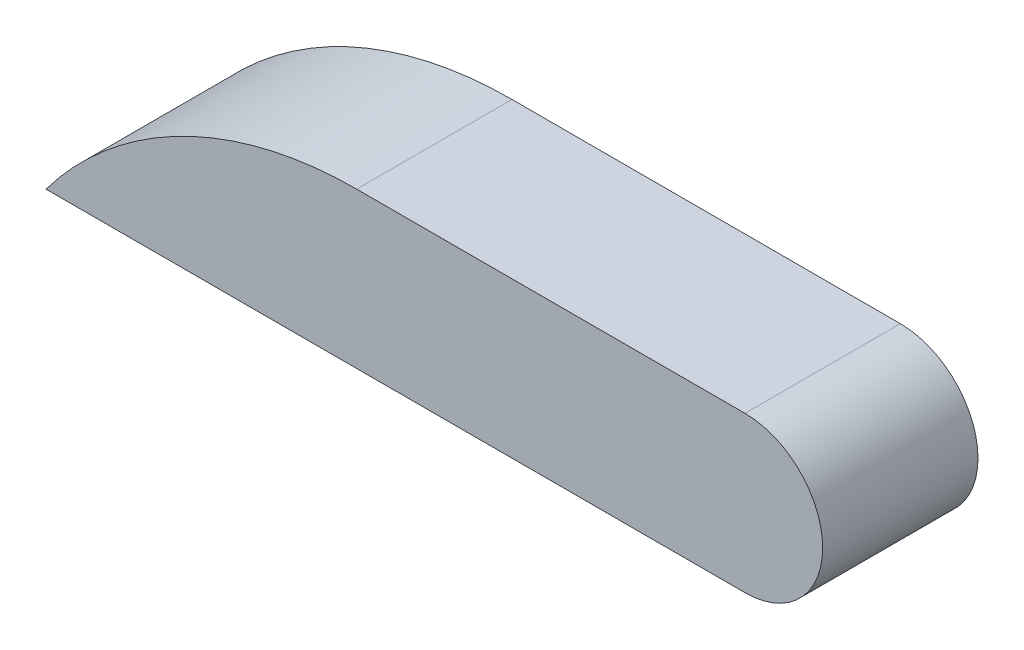
ISO-10303-21;
HEADER;
FILE_DESCRIPTION(('STEP AP214'),'2;1');
FILE_NAME('part.step','',(''),(''),'','','');
FILE_SCHEMA(('AUTOMOTIVE_DESIGN { 1 0 10303 214 1 1 1 1 }'));
ENDSEC;
DATA;
#1=APPLICATION_CONTEXT('core data for automotive mechanical design processes');
#2=APPLICATION_PROTOCOL_DEFINITION('international standard','automotive_design',2000,#1);
#3=PRODUCT_CONTEXT('',#1,'mechanical');
#4=PRODUCT('Part','Part','',(#3));
#5=PRODUCT_RELATED_PRODUCT_CATEGORY('part','',(#4));
#6=PRODUCT_DEFINITION_FORMATION('','',#4);
#7=PRODUCT_DEFINITION_CONTEXT('part definition',#1,'design');
#8=PRODUCT_DEFINITION('design','',#6,#7);
#9=PRODUCT_DEFINITION_SHAPE('','',#8);
#10=(LENGTH_UNIT() NAMED_UNIT(*) SI_UNIT(.MILLI.,.METRE.));
#11=(NAMED_UNIT(*) PLANE_ANGLE_UNIT() SI_UNIT($,.RADIAN.));
#12=(NAMED_UNIT(*) SI_UNIT($,.STERADIAN.) SOLID_ANGLE_UNIT());
#13=UNCERTAINTY_MEASURE_WITH_UNIT(LENGTH_MEASURE(1.E-05),#10,'distance_accuracy_value','');
#14=(GEOMETRIC_REPRESENTATION_CONTEXT(3) GLOBAL_UNCERTAINTY_ASSIGNED_CONTEXT((#13)) GLOBAL_UNIT_ASSIGNED_CONTEXT((#10,
#11,#12)) REPRESENTATION_CONTEXT('',''));
#15=CARTESIAN_POINT('',(0.,0.,0.));
#16=DIRECTION('',(0.,0.,1.));
#17=DIRECTION('',(1.,0.,0.));
#18=AXIS2_PLACEMENT_3D('',#15,#16,#17);
#19=CARTESIAN_POINT('',(5.08,-3.81,2.54));
#20=DIRECTION('',(0.,0.,-1.));
#21=DIRECTION('',(-1.,0.,0.));
#22=AXIS2_PLACEMENT_3D('',#19,#20,#21);
#23=CYLINDRICAL_SURFACE('',#22,6.35);
#24=CARTESIAN_POINT('',(5.08,-3.81,0.));
#25=DIRECTION('',(0.,0.,1.));
#26=DIRECTION('',(1.,0.,0.));
#27=AXIS2_PLACEMENT_3D('',#24,#25,#26);
#28=CIRCLE('',#27,6.35);
#29=CARTESIAN_POINT('',(5.08,2.54,0.));
#30=VERTEX_POINT('',#29);
#31=CARTESIAN_POINT('',(0.,0.,0.));
#32=VERTEX_POINT('',#31);
#33=EDGE_CURVE('E99',#30,#32,#28,.T.);
#34=ORIENTED_EDGE('',*,*,#33,.T.);
#35=DIRECTION('',(0.,0.,-1.));
#36=VECTOR('',#35,1.);
#37=CARTESIAN_POINT('',(0.,0.,2.54));
#38=LINE('',#37,#36);
#39=CARTESIAN_POINT('',(0.,0.,2.54));
#40=VERTEX_POINT('',#39);
#41=EDGE_CURVE('E11',#40,#32,#38,.T.);
#42=ORIENTED_EDGE('',*,*,#41,.F.);
#43=CARTESIAN_POINT('',(5.08,-3.81,2.54));
#44=DIRECTION('',(0.,0.,1.));
#45=DIRECTION('',(1.,0.,0.));
#46=AXIS2_PLACEMENT_3D('',#43,#44,#45);
#47=CIRCLE('',#46,6.35);
#48=CARTESIAN_POINT('',(5.08,2.54,2.54));
#49=VERTEX_POINT('',#48);
#50=EDGE_CURVE('E87',#49,#40,#47,.T.);
#51=ORIENTED_EDGE('',*,*,#50,.F.);
#52=DIRECTION('',(0.,0.,-1.));
#53=VECTOR('',#52,1.);
#54=CARTESIAN_POINT('',(5.08,2.54,2.54));
#55=LINE('',#54,#53);
#56=EDGE_CURVE('E95',#49,#30,#55,.T.);
#57=ORIENTED_EDGE('',*,*,#56,.T.);
#58=EDGE_LOOP('',(#34,#42,#51,#57));
#59=FACE_BOUND('',#58,.T.);
#60=ADVANCED_FACE('F36',(#59),#23,.T.);
#61=CARTESIAN_POINT('',(11.43,0.,2.54));
#62=DIRECTION('',(0.,1.,0.));
#63=DIRECTION('',(0.,0.,1.));
#64=AXIS2_PLACEMENT_3D('',#61,#62,#63);
#65=PLANE('',#64);
#66=DIRECTION('',(1.,0.,0.));
#67=VECTOR('',#66,1.);
#68=CARTESIAN_POINT('',(11.43,0.,0.));
#69=LINE('',#68,#67);
#70=CARTESIAN_POINT('',(11.43,0.,0.));
#71=VERTEX_POINT('',#70);
#72=EDGE_CURVE('E91',#32,#71,#69,.T.);
#73=ORIENTED_EDGE('',*,*,#72,.T.);
#74=DIRECTION('',(0.,0.,-1.));
#75=VECTOR('',#74,1.);
#76=CARTESIAN_POINT('',(11.43,0.,2.54));
#77=LINE('',#76,#75);
#78=CARTESIAN_POINT('',(11.43,0.,2.54));
#79=VERTEX_POINT('',#78);
#80=EDGE_CURVE('E44',#79,#71,#77,.T.);
#81=ORIENTED_EDGE('',*,*,#80,.F.);
#82=DIRECTION('',(1.,0.,0.));
#83=VECTOR('',#82,1.);
#84=CARTESIAN_POINT('',(11.43,0.,2.54));
#85=LINE('',#84,#83);
#86=EDGE_CURVE('E82',#40,#79,#85,.T.);
#87=ORIENTED_EDGE('',*,*,#86,.F.);
#88=ORIENTED_EDGE('',*,*,#41,.T.);
#89=EDGE_LOOP('',(#73,#81,#87,#88));
#90=FACE_BOUND('',#89,.T.);
#91=ADVANCED_FACE('F90',(#90),#65,.F.);
#92=CARTESIAN_POINT('',(11.43,1.27,2.54));
#93=DIRECTION('',(0.,0.,-1.));
#94=DIRECTION('',(-1.,0.,0.));
#95=AXIS2_PLACEMENT_3D('',#92,#93,#94);
#96=CYLINDRICAL_SURFACE('',#95,1.27);
#97=CARTESIAN_POINT('',(11.43,1.27,0.));
#98=DIRECTION('',(0.,0.,1.));
#99=DIRECTION('',(1.,0.,0.));
#100=AXIS2_PLACEMENT_3D('',#97,#98,#99);
#101=CIRCLE('',#100,1.27);
#102=CARTESIAN_POINT('',(11.43,2.54,0.));
#103=VERTEX_POINT('',#102);
#104=EDGE_CURVE('E69',#71,#103,#101,.T.);
#105=ORIENTED_EDGE('',*,*,#104,.T.);
#106=DIRECTION('',(0.,0.,-1.));
#107=VECTOR('',#106,1.);
#108=CARTESIAN_POINT('',(11.43,2.54,2.54));
#109=LINE('',#108,#107);
#110=CARTESIAN_POINT('',(11.43,2.54,2.54));
#111=VERTEX_POINT('',#110);
#112=EDGE_CURVE('E92',#111,#103,#109,.T.);
#113=ORIENTED_EDGE('',*,*,#112,.F.);
#114=CARTESIAN_POINT('',(11.43,1.27,2.54));
#115=DIRECTION('',(0.,0.,1.));
#116=DIRECTION('',(1.,0.,0.));
#117=AXIS2_PLACEMENT_3D('',#114,#115,#116);
#118=CIRCLE('',#117,1.27);
#119=EDGE_CURVE('E85',#79,#111,#118,.T.);
#120=ORIENTED_EDGE('',*,*,#119,.F.);
#121=ORIENTED_EDGE('',*,*,#80,.T.);
#122=EDGE_LOOP('',(#105,#113,#120,#121));
#123=FACE_BOUND('',#122,.T.);
#124=ADVANCED_FACE('F93',(#123),#96,.T.);
#125=CARTESIAN_POINT('',(11.43,2.54,2.54));
#126=DIRECTION('',(0.,-1.,0.));
#127=DIRECTION('',(1.,0.,0.));
#128=AXIS2_PLACEMENT_3D('',#125,#126,#127);
#129=PLANE('',#128);
#130=DIRECTION('',(-1.,0.,0.));
#131=VECTOR('',#130,1.);
#132=CARTESIAN_POINT('',(11.43,2.54,0.));
#133=LINE('',#132,#131);
#134=EDGE_CURVE('E75',#103,#30,#133,.T.);
#135=ORIENTED_EDGE('',*,*,#134,.T.);
#136=ORIENTED_EDGE('',*,*,#56,.F.);
#137=DIRECTION('',(-1.,0.,0.));
#138=VECTOR('',#137,1.);
#139=CARTESIAN_POINT('',(11.43,2.54,2.54));
#140=LINE('',#139,#138);
#141=EDGE_CURVE('E52',#111,#49,#140,.T.);
#142=ORIENTED_EDGE('',*,*,#141,.F.);
#143=ORIENTED_EDGE('',*,*,#112,.T.);
#144=EDGE_LOOP('',(#135,#136,#142,#143));
#145=FACE_BOUND('',#144,.T.);
#146=ADVANCED_FACE('F106',(#145),#129,.F.);
#147=CARTESIAN_POINT('',(5.08,-3.81,2.54));
#148=DIRECTION('',(0.,0.,1.));
#149=DIRECTION('',(1.,0.,0.));
#150=AXIS2_PLACEMENT_3D('',#147,#148,#149);
#151=PLANE('',#150);
#152=ORIENTED_EDGE('',*,*,#50,.T.);
#153=ORIENTED_EDGE('',*,*,#86,.T.);
#154=ORIENTED_EDGE('',*,*,#119,.T.);
#155=ORIENTED_EDGE('',*,*,#141,.T.);
#156=EDGE_LOOP('',(#152,#153,#154,#155));
#157=FACE_BOUND('',#156,.T.);
#158=ADVANCED_FACE('F83',(#157),#151,.T.);
#159=CARTESIAN_POINT('',(5.08,-3.81,0.));
#160=DIRECTION('',(0.,0.,1.));
#161=DIRECTION('',(1.,0.,0.));
#162=AXIS2_PLACEMENT_3D('',#159,#160,#161);
#163=PLANE('',#162);
#164=ORIENTED_EDGE('',*,*,#33,.F.);
#165=ORIENTED_EDGE('',*,*,#134,.F.);
#166=ORIENTED_EDGE('',*,*,#104,.F.);
#167=ORIENTED_EDGE('',*,*,#72,.F.);
#168=EDGE_LOOP('',(#164,#165,#166,#167));
#169=FACE_BOUND('',#168,.T.);
#170=ADVANCED_FACE('F109',(#169),#163,.F.);
#171=CLOSED_SHELL('',(#60,#91,#124,#146,#158,#170));
#172=MANIFOLD_SOLID_BREP('B2',#171);
#173=ADVANCED_BREP_SHAPE_REPRESENTATION('',(#18,#172),#14);
#174=SHAPE_DEFINITION_REPRESENTATION(#9,#173);
ENDSEC;
END-ISO-10303-21;
